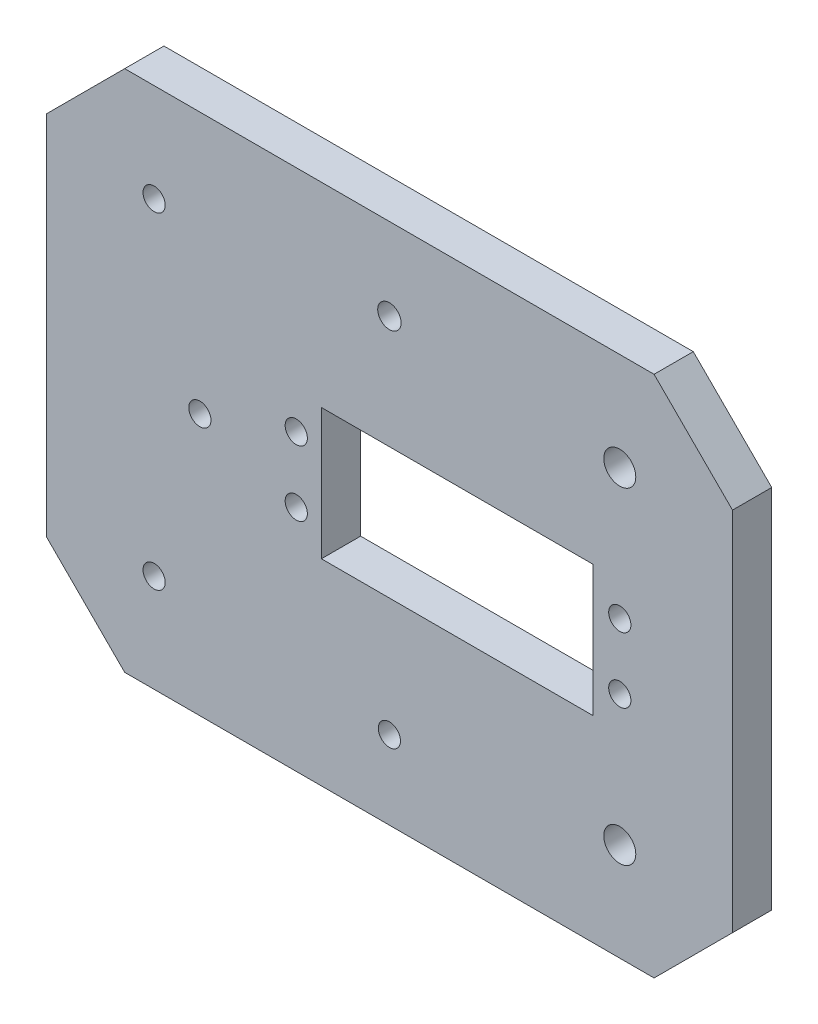
ISO-10303-21;
HEADER;
FILE_DESCRIPTION(('STEP AP214'),'2;1');
FILE_NAME('part.step','',(''),(''),'','','');
FILE_SCHEMA(('AUTOMOTIVE_DESIGN { 1 0 10303 214 1 1 1 1 }'));
ENDSEC;
DATA;
#1=APPLICATION_CONTEXT('core data for automotive mechanical design processes');
#2=APPLICATION_PROTOCOL_DEFINITION('international standard','automotive_design',2000,#1);
#3=PRODUCT_CONTEXT('',#1,'mechanical');
#4=PRODUCT('Part','Part','',(#3));
#5=PRODUCT_RELATED_PRODUCT_CATEGORY('part','',(#4));
#6=PRODUCT_DEFINITION_FORMATION('','',#4);
#7=PRODUCT_DEFINITION_CONTEXT('part definition',#1,'design');
#8=PRODUCT_DEFINITION('design','',#6,#7);
#9=PRODUCT_DEFINITION_SHAPE('','',#8);
#10=(LENGTH_UNIT() NAMED_UNIT(*) SI_UNIT(.MILLI.,.METRE.));
#11=(NAMED_UNIT(*) PLANE_ANGLE_UNIT() SI_UNIT($,.RADIAN.));
#12=(NAMED_UNIT(*) SI_UNIT($,.STERADIAN.) SOLID_ANGLE_UNIT());
#13=UNCERTAINTY_MEASURE_WITH_UNIT(LENGTH_MEASURE(1.E-05),#10,'distance_accuracy_value','');
#14=(GEOMETRIC_REPRESENTATION_CONTEXT(3) GLOBAL_UNCERTAINTY_ASSIGNED_CONTEXT((#13)) GLOBAL_UNIT_ASSIGNED_CONTEXT((#10,
#11,#12)) REPRESENTATION_CONTEXT('',''));
#15=CARTESIAN_POINT('',(0.,0.,0.));
#16=DIRECTION('',(0.,0.,1.));
#17=DIRECTION('',(1.,0.,0.));
#18=AXIS2_PLACEMENT_3D('',#15,#16,#17);
#19=CARTESIAN_POINT('',(0.,0.,6.));
#20=DIRECTION('',(0.,0.,1.));
#21=DIRECTION('',(1.,0.,0.));
#22=AXIS2_PLACEMENT_3D('',#19,#20,#21);
#23=PLANE('',#22);
#24=CARTESIAN_POINT('',(0.,-28.,6.));
#25=DIRECTION('',(0.,0.,1.));
#26=DIRECTION('',(1.,0.,0.));
#27=AXIS2_PLACEMENT_3D('',#24,#25,#26);
#28=CIRCLE('',#27,1.7);
#29=CARTESIAN_POINT('',(1.7,-28.,6.));
#30=VERTEX_POINT('',#29);
#31=EDGE_CURVE('E355',#30,#30,#28,.T.);
#32=ORIENTED_EDGE('',*,*,#31,.F.);
#33=EDGE_LOOP('',(#32));
#34=FACE_BOUND('',#33,.T.);
#35=CARTESIAN_POINT('',(35.25,25.,6.));
#36=DIRECTION('',(0.,0.,1.));
#37=DIRECTION('',(1.,0.,0.));
#38=AXIS2_PLACEMENT_3D('',#35,#36,#37);
#39=CIRCLE('',#38,2.45);
#40=CARTESIAN_POINT('',(37.7,25.,6.));
#41=VERTEX_POINT('',#40);
#42=EDGE_CURVE('E367',#41,#41,#39,.T.);
#43=ORIENTED_EDGE('',*,*,#42,.F.);
#44=EDGE_LOOP('',(#43));
#45=FACE_BOUND('',#44,.T.);
#46=CARTESIAN_POINT('',(-36.,25.,6.));
#47=DIRECTION('',(0.,0.,1.));
#48=DIRECTION('',(1.,0.,0.));
#49=AXIS2_PLACEMENT_3D('',#46,#47,#48);
#50=CIRCLE('',#49,1.7);
#51=CARTESIAN_POINT('',(-34.3,25.,6.));
#52=VERTEX_POINT('',#51);
#53=EDGE_CURVE('E379',#52,#52,#50,.T.);
#54=ORIENTED_EDGE('',*,*,#53,.F.);
#55=EDGE_LOOP('',(#54));
#56=FACE_BOUND('',#55,.T.);
#57=CARTESIAN_POINT('',(35.25,5.,6.));
#58=DIRECTION('',(0.,0.,1.));
#59=DIRECTION('',(1.,0.,0.));
#60=AXIS2_PLACEMENT_3D('',#57,#58,#59);
#61=CIRCLE('',#60,1.7);
#62=CARTESIAN_POINT('',(36.95,5.,6.));
#63=VERTEX_POINT('',#62);
#64=EDGE_CURVE('E391',#63,#63,#61,.T.);
#65=ORIENTED_EDGE('',*,*,#64,.F.);
#66=EDGE_LOOP('',(#65));
#67=FACE_BOUND('',#66,.T.);
#68=CARTESIAN_POINT('',(-14.25,5.,6.));
#69=DIRECTION('',(0.,0.,1.));
#70=DIRECTION('',(1.,0.,0.));
#71=AXIS2_PLACEMENT_3D('',#68,#69,#70);
#72=CIRCLE('',#71,1.7);
#73=CARTESIAN_POINT('',(-12.55,5.,6.));
#74=VERTEX_POINT('',#73);
#75=EDGE_CURVE('E403',#74,#74,#72,.T.);
#76=ORIENTED_EDGE('',*,*,#75,.F.);
#77=EDGE_LOOP('',(#76));
#78=FACE_BOUND('',#77,.T.);
#79=DIRECTION('',(1.,0.,0.));
#80=VECTOR('',#79,1.);
#81=CARTESIAN_POINT('',(-10.3999999999998,-9.90000000000016,6.));
#82=LINE('',#81,#80);
#83=CARTESIAN_POINT('',(-10.3999999999998,-9.90000000000016,6.));
#84=VERTEX_POINT('',#83);
#85=CARTESIAN_POINT('',(31.15,-9.90000000000016,6.));
#86=VERTEX_POINT('',#85);
#87=EDGE_CURVE('E138',#84,#86,#82,.T.);
#88=ORIENTED_EDGE('',*,*,#87,.F.);
#89=DIRECTION('',(0.,-1.,0.));
#90=VECTOR('',#89,1.);
#91=CARTESIAN_POINT('',(-10.3999999999998,-9.90000000000016,6.));
#92=LINE('',#91,#90);
#93=CARTESIAN_POINT('',(-10.3999999999998,10.15,6.));
#94=VERTEX_POINT('',#93);
#95=EDGE_CURVE('E130',#94,#84,#92,.T.);
#96=ORIENTED_EDGE('',*,*,#95,.F.);
#97=DIRECTION('',(-1.,0.,0.));
#98=VECTOR('',#97,1.);
#99=CARTESIAN_POINT('',(-10.3999999999998,10.15,6.));
#100=LINE('',#99,#98);
#101=CARTESIAN_POINT('',(31.15,10.15,6.));
#102=VERTEX_POINT('',#101);
#103=EDGE_CURVE('E153',#102,#94,#100,.T.);
#104=ORIENTED_EDGE('',*,*,#103,.F.);
#105=DIRECTION('',(0.,1.,0.));
#106=VECTOR('',#105,1.);
#107=CARTESIAN_POINT('',(31.15,-9.90000000000016,6.));
#108=LINE('',#107,#106);
#109=EDGE_CURVE('E151',#86,#102,#108,.T.);
#110=ORIENTED_EDGE('',*,*,#109,.F.);
#111=EDGE_LOOP('',(#88,#96,#104,#110));
#112=FACE_BOUND('',#111,.T.);
#113=DIRECTION('',(0.707106781186544,-0.707106781186551,0.));
#114=VECTOR('',#113,1.);
#115=CARTESIAN_POINT('',(-52.4999999999999,-28.,6.));
#116=LINE('',#115,#114);
#117=CARTESIAN_POINT('',(-52.4999999999999,-28.,6.));
#118=VERTEX_POINT('',#117);
#119=CARTESIAN_POINT('',(-40.5,-40.,6.));
#120=VERTEX_POINT('',#119);
#121=EDGE_CURVE('E169',#118,#120,#116,.T.);
#122=ORIENTED_EDGE('',*,*,#121,.T.);
#123=DIRECTION('',(1.,0.,0.));
#124=VECTOR('',#123,1.);
#125=CARTESIAN_POINT('',(-40.5,-40.,6.));
#126=LINE('',#125,#124);
#127=CARTESIAN_POINT('',(40.5,-40.,6.));
#128=VERTEX_POINT('',#127);
#129=EDGE_CURVE('E172',#120,#128,#126,.T.);
#130=ORIENTED_EDGE('',*,*,#129,.T.);
#131=DIRECTION('',(0.707106781186546,0.707106781186549,0.));
#132=VECTOR('',#131,1.);
#133=CARTESIAN_POINT('',(40.5,-40.,6.));
#134=LINE('',#133,#132);
#135=CARTESIAN_POINT('',(52.5,-28.,6.));
#136=VERTEX_POINT('',#135);
#137=EDGE_CURVE('E175',#128,#136,#134,.T.);
#138=ORIENTED_EDGE('',*,*,#137,.T.);
#139=DIRECTION('',(0.,1.,0.));
#140=VECTOR('',#139,1.);
#141=CARTESIAN_POINT('',(52.5,-28.,6.));
#142=LINE('',#141,#140);
#143=CARTESIAN_POINT('',(52.5,28.,6.));
#144=VERTEX_POINT('',#143);
#145=EDGE_CURVE('E177',#136,#144,#142,.T.);
#146=ORIENTED_EDGE('',*,*,#145,.T.);
#147=DIRECTION('',(-0.707106781186549,0.707106781186546,0.));
#148=VECTOR('',#147,1.);
#149=CARTESIAN_POINT('',(52.5,28.,6.));
#150=LINE('',#149,#148);
#151=CARTESIAN_POINT('',(40.5,39.9999999999999,6.));
#152=VERTEX_POINT('',#151);
#153=EDGE_CURVE('E179',#144,#152,#150,.T.);
#154=ORIENTED_EDGE('',*,*,#153,.T.);
#155=DIRECTION('',(-1.,0.,0.));
#156=VECTOR('',#155,1.);
#157=CARTESIAN_POINT('',(40.5,39.9999999999999,6.));
#158=LINE('',#157,#156);
#159=CARTESIAN_POINT('',(-40.5,39.9999999999999,6.));
#160=VERTEX_POINT('',#159);
#161=EDGE_CURVE('E181',#152,#160,#158,.T.);
#162=ORIENTED_EDGE('',*,*,#161,.T.);
#163=DIRECTION('',(-0.707106781186546,-0.707106781186549,0.));
#164=VECTOR('',#163,1.);
#165=CARTESIAN_POINT('',(-40.5,39.9999999999999,6.));
#166=LINE('',#165,#164);
#167=CARTESIAN_POINT('',(-52.4999999999999,28.,6.));
#168=VERTEX_POINT('',#167);
#169=EDGE_CURVE('E183',#160,#168,#166,.T.);
#170=ORIENTED_EDGE('',*,*,#169,.T.);
#171=DIRECTION('',(0.,-1.,0.));
#172=VECTOR('',#171,1.);
#173=CARTESIAN_POINT('',(-52.4999999999999,28.,6.));
#174=LINE('',#173,#172);
#175=EDGE_CURVE('E185',#168,#118,#174,.T.);
#176=ORIENTED_EDGE('',*,*,#175,.T.);
#177=EDGE_LOOP('',(#122,#130,#138,#146,#154,#162,#170,#176));
#178=FACE_BOUND('',#177,.T.);
#179=CARTESIAN_POINT('',(-14.25,-5.,6.));
#180=DIRECTION('',(0.,0.,1.));
#181=DIRECTION('',(1.,0.,0.));
#182=AXIS2_PLACEMENT_3D('',#179,#180,#181);
#183=CIRCLE('',#182,1.7);
#184=CARTESIAN_POINT('',(-12.55,-5.,6.));
#185=VERTEX_POINT('',#184);
#186=EDGE_CURVE('E159',#185,#185,#183,.T.);
#187=ORIENTED_EDGE('',*,*,#186,.F.);
#188=EDGE_LOOP('',(#187));
#189=FACE_BOUND('',#188,.T.);
#190=CARTESIAN_POINT('',(35.25,-5.,6.));
#191=DIRECTION('',(0.,0.,1.));
#192=DIRECTION('',(1.,0.,0.));
#193=AXIS2_PLACEMENT_3D('',#190,#191,#192);
#194=CIRCLE('',#193,1.7);
#195=CARTESIAN_POINT('',(36.95,-5.,6.));
#196=VERTEX_POINT('',#195);
#197=EDGE_CURVE('E397',#196,#196,#194,.T.);
#198=ORIENTED_EDGE('',*,*,#197,.F.);
#199=EDGE_LOOP('',(#198));
#200=FACE_BOUND('',#199,.T.);
#201=CARTESIAN_POINT('',(-36.,-25.,6.));
#202=DIRECTION('',(0.,0.,1.));
#203=DIRECTION('',(1.,0.,0.));
#204=AXIS2_PLACEMENT_3D('',#201,#202,#203);
#205=CIRCLE('',#204,1.7);
#206=CARTESIAN_POINT('',(-34.3,-25.,6.));
#207=VERTEX_POINT('',#206);
#208=EDGE_CURVE('E385',#207,#207,#205,.T.);
#209=ORIENTED_EDGE('',*,*,#208,.F.);
#210=EDGE_LOOP('',(#209));
#211=FACE_BOUND('',#210,.T.);
#212=CARTESIAN_POINT('',(35.25,-25.,6.));
#213=DIRECTION('',(0.,0.,1.));
#214=DIRECTION('',(1.,0.,0.));
#215=AXIS2_PLACEMENT_3D('',#212,#213,#214);
#216=CIRCLE('',#215,2.45);
#217=CARTESIAN_POINT('',(37.7,-25.,6.));
#218=VERTEX_POINT('',#217);
#219=EDGE_CURVE('E373',#218,#218,#216,.T.);
#220=ORIENTED_EDGE('',*,*,#219,.F.);
#221=EDGE_LOOP('',(#220));
#222=FACE_BOUND('',#221,.T.);
#223=CARTESIAN_POINT('',(0.,27.45,6.));
#224=DIRECTION('',(0.,0.,1.));
#225=DIRECTION('',(1.,0.,0.));
#226=AXIS2_PLACEMENT_3D('',#223,#224,#225);
#227=CIRCLE('',#226,1.78675683852056);
#228=CARTESIAN_POINT('',(1.78675683852056,27.45,6.));
#229=VERTEX_POINT('',#228);
#230=EDGE_CURVE('E361',#229,#229,#227,.T.);
#231=ORIENTED_EDGE('',*,*,#230,.F.);
#232=EDGE_LOOP('',(#231));
#233=FACE_BOUND('',#232,.T.);
#234=CARTESIAN_POINT('',(-29.,0.,6.));
#235=DIRECTION('',(0.,0.,1.));
#236=DIRECTION('',(1.,0.,0.));
#237=AXIS2_PLACEMENT_3D('',#234,#235,#236);
#238=CIRCLE('',#237,1.7);
#239=CARTESIAN_POINT('',(-27.3,0.,6.));
#240=VERTEX_POINT('',#239);
#241=EDGE_CURVE('E346',#240,#240,#238,.T.);
#242=ORIENTED_EDGE('',*,*,#241,.F.);
#243=EDGE_LOOP('',(#242));
#244=FACE_BOUND('',#243,.T.);
#245=ADVANCED_FACE('F41',(#34,#45,#56,#67,#78,#112,#178,#189,#200,#211,#222,#233,#244),#23,.T.);
#246=CARTESIAN_POINT('',(0.,0.,0.));
#247=DIRECTION('',(0.,0.,1.));
#248=DIRECTION('',(1.,0.,0.));
#249=AXIS2_PLACEMENT_3D('',#246,#247,#248);
#250=PLANE('',#249);
#251=DIRECTION('',(0.707106781186544,-0.707106781186551,0.));
#252=VECTOR('',#251,1.);
#253=CARTESIAN_POINT('',(-52.4999999999999,-28.,0.));
#254=LINE('',#253,#252);
#255=CARTESIAN_POINT('',(-52.4999999999999,-28.,0.));
#256=VERTEX_POINT('',#255);
#257=CARTESIAN_POINT('',(-40.5,-40.,0.));
#258=VERTEX_POINT('',#257);
#259=EDGE_CURVE('E146',#256,#258,#254,.T.);
#260=ORIENTED_EDGE('',*,*,#259,.F.);
#261=DIRECTION('',(0.,-1.,0.));
#262=VECTOR('',#261,1.);
#263=CARTESIAN_POINT('',(-52.4999999999999,28.,0.));
#264=LINE('',#263,#262);
#265=CARTESIAN_POINT('',(-52.4999999999999,28.,0.));
#266=VERTEX_POINT('',#265);
#267=EDGE_CURVE('E173',#266,#256,#264,.T.);
#268=ORIENTED_EDGE('',*,*,#267,.F.);
#269=DIRECTION('',(-0.707106781186546,-0.707106781186549,0.));
#270=VECTOR('',#269,1.);
#271=CARTESIAN_POINT('',(-40.5,39.9999999999999,0.));
#272=LINE('',#271,#270);
#273=CARTESIAN_POINT('',(-40.5,39.9999999999999,0.));
#274=VERTEX_POINT('',#273);
#275=EDGE_CURVE('E200',#274,#266,#272,.T.);
#276=ORIENTED_EDGE('',*,*,#275,.F.);
#277=DIRECTION('',(-1.,0.,0.));
#278=VECTOR('',#277,1.);
#279=CARTESIAN_POINT('',(40.5,39.9999999999999,0.));
#280=LINE('',#279,#278);
#281=CARTESIAN_POINT('',(40.5,39.9999999999999,0.));
#282=VERTEX_POINT('',#281);
#283=EDGE_CURVE('E198',#282,#274,#280,.T.);
#284=ORIENTED_EDGE('',*,*,#283,.F.);
#285=DIRECTION('',(-0.707106781186549,0.707106781186546,0.));
#286=VECTOR('',#285,1.);
#287=CARTESIAN_POINT('',(52.5,28.,0.));
#288=LINE('',#287,#286);
#289=CARTESIAN_POINT('',(52.5,28.,0.));
#290=VERTEX_POINT('',#289);
#291=EDGE_CURVE('E196',#290,#282,#288,.T.);
#292=ORIENTED_EDGE('',*,*,#291,.F.);
#293=DIRECTION('',(0.,1.,0.));
#294=VECTOR('',#293,1.);
#295=CARTESIAN_POINT('',(52.5,-28.,0.));
#296=LINE('',#295,#294);
#297=CARTESIAN_POINT('',(52.5,-28.,0.));
#298=VERTEX_POINT('',#297);
#299=EDGE_CURVE('E194',#298,#290,#296,.T.);
#300=ORIENTED_EDGE('',*,*,#299,.F.);
#301=DIRECTION('',(0.707106781186546,0.707106781186549,0.));
#302=VECTOR('',#301,1.);
#303=CARTESIAN_POINT('',(40.5,-40.,0.));
#304=LINE('',#303,#302);
#305=CARTESIAN_POINT('',(40.5,-40.,0.));
#306=VERTEX_POINT('',#305);
#307=EDGE_CURVE('E192',#306,#298,#304,.T.);
#308=ORIENTED_EDGE('',*,*,#307,.F.);
#309=DIRECTION('',(1.,0.,0.));
#310=VECTOR('',#309,1.);
#311=CARTESIAN_POINT('',(-40.5,-40.,0.));
#312=LINE('',#311,#310);
#313=EDGE_CURVE('E190',#258,#306,#312,.T.);
#314=ORIENTED_EDGE('',*,*,#313,.F.);
#315=EDGE_LOOP('',(#260,#268,#276,#284,#292,#300,#308,#314));
#316=FACE_BOUND('',#315,.T.);
#317=DIRECTION('',(0.,-1.,0.));
#318=VECTOR('',#317,1.);
#319=CARTESIAN_POINT('',(-10.3999999999998,-9.90000000000016,0.));
#320=LINE('',#319,#318);
#321=CARTESIAN_POINT('',(-10.3999999999998,10.15,0.));
#322=VERTEX_POINT('',#321);
#323=CARTESIAN_POINT('',(-10.3999999999998,-9.90000000000016,0.));
#324=VERTEX_POINT('',#323);
#325=EDGE_CURVE('E64',#322,#324,#320,.T.);
#326=ORIENTED_EDGE('',*,*,#325,.T.);
#327=DIRECTION('',(1.,0.,0.));
#328=VECTOR('',#327,1.);
#329=CARTESIAN_POINT('',(-10.3999999999998,-9.90000000000016,0.));
#330=LINE('',#329,#328);
#331=CARTESIAN_POINT('',(31.15,-9.90000000000016,0.));
#332=VERTEX_POINT('',#331);
#333=EDGE_CURVE('E145',#324,#332,#330,.T.);
#334=ORIENTED_EDGE('',*,*,#333,.T.);
#335=DIRECTION('',(0.,1.,0.));
#336=VECTOR('',#335,1.);
#337=CARTESIAN_POINT('',(31.15,-9.90000000000016,0.));
#338=LINE('',#337,#336);
#339=CARTESIAN_POINT('',(31.15,10.15,0.));
#340=VERTEX_POINT('',#339);
#341=EDGE_CURVE('E161',#332,#340,#338,.T.);
#342=ORIENTED_EDGE('',*,*,#341,.T.);
#343=DIRECTION('',(-1.,0.,0.));
#344=VECTOR('',#343,1.);
#345=CARTESIAN_POINT('',(-10.3999999999998,10.15,0.));
#346=LINE('',#345,#344);
#347=EDGE_CURVE('E139',#340,#322,#346,.T.);
#348=ORIENTED_EDGE('',*,*,#347,.T.);
#349=EDGE_LOOP('',(#326,#334,#342,#348));
#350=FACE_BOUND('',#349,.T.);
#351=CARTESIAN_POINT('',(-14.25,-5.,0.));
#352=DIRECTION('',(0.,0.,1.));
#353=DIRECTION('',(1.,0.,0.));
#354=AXIS2_PLACEMENT_3D('',#351,#352,#353);
#355=CIRCLE('',#354,1.7);
#356=CARTESIAN_POINT('',(-12.55,-5.,0.));
#357=VERTEX_POINT('',#356);
#358=EDGE_CURVE('E406',#357,#357,#355,.T.);
#359=ORIENTED_EDGE('',*,*,#358,.T.);
#360=EDGE_LOOP('',(#359));
#361=FACE_BOUND('',#360,.T.);
#362=CARTESIAN_POINT('',(-14.25,5.,0.));
#363=DIRECTION('',(0.,0.,1.));
#364=DIRECTION('',(1.,0.,0.));
#365=AXIS2_PLACEMENT_3D('',#362,#363,#364);
#366=CIRCLE('',#365,1.7);
#367=CARTESIAN_POINT('',(-12.55,5.,0.));
#368=VERTEX_POINT('',#367);
#369=EDGE_CURVE('E400',#368,#368,#366,.T.);
#370=ORIENTED_EDGE('',*,*,#369,.T.);
#371=EDGE_LOOP('',(#370));
#372=FACE_BOUND('',#371,.T.);
#373=CARTESIAN_POINT('',(35.25,-5.,0.));
#374=DIRECTION('',(0.,0.,1.));
#375=DIRECTION('',(1.,0.,0.));
#376=AXIS2_PLACEMENT_3D('',#373,#374,#375);
#377=CIRCLE('',#376,1.7);
#378=CARTESIAN_POINT('',(36.95,-5.,0.));
#379=VERTEX_POINT('',#378);
#380=EDGE_CURVE('E394',#379,#379,#377,.T.);
#381=ORIENTED_EDGE('',*,*,#380,.T.);
#382=EDGE_LOOP('',(#381));
#383=FACE_BOUND('',#382,.T.);
#384=CARTESIAN_POINT('',(35.25,5.,0.));
#385=DIRECTION('',(0.,0.,1.));
#386=DIRECTION('',(1.,0.,0.));
#387=AXIS2_PLACEMENT_3D('',#384,#385,#386);
#388=CIRCLE('',#387,1.7);
#389=CARTESIAN_POINT('',(36.95,5.,0.));
#390=VERTEX_POINT('',#389);
#391=EDGE_CURVE('E388',#390,#390,#388,.T.);
#392=ORIENTED_EDGE('',*,*,#391,.T.);
#393=EDGE_LOOP('',(#392));
#394=FACE_BOUND('',#393,.T.);
#395=CARTESIAN_POINT('',(-36.,-25.,0.));
#396=DIRECTION('',(0.,0.,1.));
#397=DIRECTION('',(1.,0.,0.));
#398=AXIS2_PLACEMENT_3D('',#395,#396,#397);
#399=CIRCLE('',#398,1.7);
#400=CARTESIAN_POINT('',(-34.3,-25.,0.));
#401=VERTEX_POINT('',#400);
#402=EDGE_CURVE('E382',#401,#401,#399,.T.);
#403=ORIENTED_EDGE('',*,*,#402,.T.);
#404=EDGE_LOOP('',(#403));
#405=FACE_BOUND('',#404,.T.);
#406=CARTESIAN_POINT('',(-36.,25.,0.));
#407=DIRECTION('',(0.,0.,1.));
#408=DIRECTION('',(1.,0.,0.));
#409=AXIS2_PLACEMENT_3D('',#406,#407,#408);
#410=CIRCLE('',#409,1.7);
#411=CARTESIAN_POINT('',(-34.3,25.,0.));
#412=VERTEX_POINT('',#411);
#413=EDGE_CURVE('E376',#412,#412,#410,.T.);
#414=ORIENTED_EDGE('',*,*,#413,.T.);
#415=EDGE_LOOP('',(#414));
#416=FACE_BOUND('',#415,.T.);
#417=CARTESIAN_POINT('',(35.25,-25.,0.));
#418=DIRECTION('',(0.,0.,1.));
#419=DIRECTION('',(1.,0.,0.));
#420=AXIS2_PLACEMENT_3D('',#417,#418,#419);
#421=CIRCLE('',#420,2.45);
#422=CARTESIAN_POINT('',(37.7,-25.,0.));
#423=VERTEX_POINT('',#422);
#424=EDGE_CURVE('E370',#423,#423,#421,.T.);
#425=ORIENTED_EDGE('',*,*,#424,.T.);
#426=EDGE_LOOP('',(#425));
#427=FACE_BOUND('',#426,.T.);
#428=CARTESIAN_POINT('',(35.25,25.,0.));
#429=DIRECTION('',(0.,0.,1.));
#430=DIRECTION('',(1.,0.,0.));
#431=AXIS2_PLACEMENT_3D('',#428,#429,#430);
#432=CIRCLE('',#431,2.45);
#433=CARTESIAN_POINT('',(37.7,25.,0.));
#434=VERTEX_POINT('',#433);
#435=EDGE_CURVE('E364',#434,#434,#432,.T.);
#436=ORIENTED_EDGE('',*,*,#435,.T.);
#437=EDGE_LOOP('',(#436));
#438=FACE_BOUND('',#437,.T.);
#439=CARTESIAN_POINT('',(0.,27.45,0.));
#440=DIRECTION('',(0.,0.,1.));
#441=DIRECTION('',(1.,0.,0.));
#442=AXIS2_PLACEMENT_3D('',#439,#440,#441);
#443=CIRCLE('',#442,1.78675683852056);
#444=CARTESIAN_POINT('',(1.78675683852056,27.45,0.));
#445=VERTEX_POINT('',#444);
#446=EDGE_CURVE('E358',#445,#445,#443,.T.);
#447=ORIENTED_EDGE('',*,*,#446,.T.);
#448=EDGE_LOOP('',(#447));
#449=FACE_BOUND('',#448,.T.);
#450=CARTESIAN_POINT('',(0.,-28.,0.));
#451=DIRECTION('',(0.,0.,1.));
#452=DIRECTION('',(1.,0.,0.));
#453=AXIS2_PLACEMENT_3D('',#450,#451,#452);
#454=CIRCLE('',#453,1.7);
#455=CARTESIAN_POINT('',(1.7,-28.,0.));
#456=VERTEX_POINT('',#455);
#457=EDGE_CURVE('E352',#456,#456,#454,.T.);
#458=ORIENTED_EDGE('',*,*,#457,.T.);
#459=EDGE_LOOP('',(#458));
#460=FACE_BOUND('',#459,.T.);
#461=CARTESIAN_POINT('',(-29.,0.,0.));
#462=DIRECTION('',(0.,0.,1.));
#463=DIRECTION('',(1.,0.,0.));
#464=AXIS2_PLACEMENT_3D('',#461,#462,#463);
#465=CIRCLE('',#464,1.7);
#466=CARTESIAN_POINT('',(-27.3,0.,0.));
#467=VERTEX_POINT('',#466);
#468=EDGE_CURVE('E349',#467,#467,#465,.T.);
#469=ORIENTED_EDGE('',*,*,#468,.T.);
#470=EDGE_LOOP('',(#469));
#471=FACE_BOUND('',#470,.T.);
#472=ADVANCED_FACE('F230',(#316,#350,#361,#372,#383,#394,#405,#416,#427,#438,#449,#460,#471),
#250,.F.);
#473=CARTESIAN_POINT('',(-52.4999999999999,-28.,6.));
#474=DIRECTION('',(0.707106781186551,0.707106781186544,0.));
#475=DIRECTION('',(-0.707106781186544,0.707106781186551,0.));
#476=AXIS2_PLACEMENT_3D('',#473,#474,#475);
#477=PLANE('',#476);
#478=ORIENTED_EDGE('',*,*,#259,.T.);
#479=DIRECTION('',(0.,0.,-1.));
#480=VECTOR('',#479,1.);
#481=CARTESIAN_POINT('',(-40.5,-40.,6.));
#482=LINE('',#481,#480);
#483=EDGE_CURVE('E11',#120,#258,#482,.T.);
#484=ORIENTED_EDGE('',*,*,#483,.F.);
#485=ORIENTED_EDGE('',*,*,#121,.F.);
#486=DIRECTION('',(0.,0.,-1.));
#487=VECTOR('',#486,1.);
#488=CARTESIAN_POINT('',(-52.4999999999999,-28.,6.));
#489=LINE('',#488,#487);
#490=EDGE_CURVE('E187',#118,#256,#489,.T.);
#491=ORIENTED_EDGE('',*,*,#490,.T.);
#492=EDGE_LOOP('',(#478,#484,#485,#491));
#493=FACE_BOUND('',#492,.T.);
#494=ADVANCED_FACE('F43',(#493),#477,.F.);
#495=CARTESIAN_POINT('',(-40.5,-40.,6.));
#496=DIRECTION('',(0.,1.,0.));
#497=DIRECTION('',(0.,0.,1.));
#498=AXIS2_PLACEMENT_3D('',#495,#496,#497);
#499=PLANE('',#498);
#500=ORIENTED_EDGE('',*,*,#313,.T.);
#501=DIRECTION('',(0.,0.,-1.));
#502=VECTOR('',#501,1.);
#503=CARTESIAN_POINT('',(40.5,-40.,6.));
#504=LINE('',#503,#502);
#505=EDGE_CURVE('E49',#128,#306,#504,.T.);
#506=ORIENTED_EDGE('',*,*,#505,.F.);
#507=ORIENTED_EDGE('',*,*,#129,.F.);
#508=ORIENTED_EDGE('',*,*,#483,.T.);
#509=EDGE_LOOP('',(#500,#506,#507,#508));
#510=FACE_BOUND('',#509,.T.);
#511=ADVANCED_FACE('F247',(#510),#499,.F.);
#512=CARTESIAN_POINT('',(40.5,-40.,6.));
#513=DIRECTION('',(-0.707106781186549,0.707106781186546,0.));
#514=DIRECTION('',(-0.707106781186546,-0.707106781186549,0.));
#515=AXIS2_PLACEMENT_3D('',#512,#513,#514);
#516=PLANE('',#515);
#517=ORIENTED_EDGE('',*,*,#307,.T.);
#518=DIRECTION('',(0.,0.,-1.));
#519=VECTOR('',#518,1.);
#520=CARTESIAN_POINT('',(52.5,-28.,6.));
#521=LINE('',#520,#519);
#522=EDGE_CURVE('E217',#136,#298,#521,.T.);
#523=ORIENTED_EDGE('',*,*,#522,.F.);
#524=ORIENTED_EDGE('',*,*,#137,.F.);
#525=ORIENTED_EDGE('',*,*,#505,.T.);
#526=EDGE_LOOP('',(#517,#523,#524,#525));
#527=FACE_BOUND('',#526,.T.);
#528=ADVANCED_FACE('F224',(#527),#516,.F.);
#529=CARTESIAN_POINT('',(52.5,-28.,6.));
#530=DIRECTION('',(-1.,0.,0.));
#531=DIRECTION('',(0.,0.,1.));
#532=AXIS2_PLACEMENT_3D('',#529,#530,#531);
#533=PLANE('',#532);
#534=ORIENTED_EDGE('',*,*,#299,.T.);
#535=DIRECTION('',(0.,0.,-1.));
#536=VECTOR('',#535,1.);
#537=CARTESIAN_POINT('',(52.5,28.,6.));
#538=LINE('',#537,#536);
#539=EDGE_CURVE('E214',#144,#290,#538,.T.);
#540=ORIENTED_EDGE('',*,*,#539,.F.);
#541=ORIENTED_EDGE('',*,*,#145,.F.);
#542=ORIENTED_EDGE('',*,*,#522,.T.);
#543=EDGE_LOOP('',(#534,#540,#541,#542));
#544=FACE_BOUND('',#543,.T.);
#545=ADVANCED_FACE('F236',(#544),#533,.F.);
#546=CARTESIAN_POINT('',(52.5,28.,6.));
#547=DIRECTION('',(-0.707106781186546,-0.707106781186549,0.));
#548=DIRECTION('',(0.707106781186549,-0.707106781186546,0.));
#549=AXIS2_PLACEMENT_3D('',#546,#547,#548);
#550=PLANE('',#549);
#551=ORIENTED_EDGE('',*,*,#291,.T.);
#552=DIRECTION('',(0.,0.,-1.));
#553=VECTOR('',#552,1.);
#554=CARTESIAN_POINT('',(40.5,39.9999999999999,6.));
#555=LINE('',#554,#553);
#556=EDGE_CURVE('E211',#152,#282,#555,.T.);
#557=ORIENTED_EDGE('',*,*,#556,.F.);
#558=ORIENTED_EDGE('',*,*,#153,.F.);
#559=ORIENTED_EDGE('',*,*,#539,.T.);
#560=EDGE_LOOP('',(#551,#557,#558,#559));
#561=FACE_BOUND('',#560,.T.);
#562=ADVANCED_FACE('F240',(#561),#550,.F.);
#563=CARTESIAN_POINT('',(40.5,39.9999999999999,6.));
#564=DIRECTION('',(0.,-1.,0.));
#565=DIRECTION('',(0.,0.,-1.));
#566=AXIS2_PLACEMENT_3D('',#563,#564,#565);
#567=PLANE('',#566);
#568=ORIENTED_EDGE('',*,*,#283,.T.);
#569=DIRECTION('',(0.,0.,-1.));
#570=VECTOR('',#569,1.);
#571=CARTESIAN_POINT('',(-40.5,39.9999999999999,6.));
#572=LINE('',#571,#570);
#573=EDGE_CURVE('E208',#160,#274,#572,.T.);
#574=ORIENTED_EDGE('',*,*,#573,.F.);
#575=ORIENTED_EDGE('',*,*,#161,.F.);
#576=ORIENTED_EDGE('',*,*,#556,.T.);
#577=EDGE_LOOP('',(#568,#574,#575,#576));
#578=FACE_BOUND('',#577,.T.);
#579=ADVANCED_FACE('F260',(#578),#567,.F.);
#580=CARTESIAN_POINT('',(-40.5,39.9999999999999,6.));
#581=DIRECTION('',(0.707106781186548,-0.707106781186546,0.));
#582=DIRECTION('',(0.707106781186546,0.707106781186549,0.));
#583=AXIS2_PLACEMENT_3D('',#580,#581,#582);
#584=PLANE('',#583);
#585=ORIENTED_EDGE('',*,*,#275,.T.);
#586=DIRECTION('',(0.,0.,-1.));
#587=VECTOR('',#586,1.);
#588=CARTESIAN_POINT('',(-52.4999999999999,28.,6.));
#589=LINE('',#588,#587);
#590=EDGE_CURVE('E205',#168,#266,#589,.T.);
#591=ORIENTED_EDGE('',*,*,#590,.F.);
#592=ORIENTED_EDGE('',*,*,#169,.F.);
#593=ORIENTED_EDGE('',*,*,#573,.T.);
#594=EDGE_LOOP('',(#585,#591,#592,#593));
#595=FACE_BOUND('',#594,.T.);
#596=ADVANCED_FACE('F258',(#595),#584,.F.);
#597=CARTESIAN_POINT('',(-52.4999999999999,28.,6.));
#598=DIRECTION('',(1.,0.,0.));
#599=DIRECTION('',(0.,0.,-1.));
#600=AXIS2_PLACEMENT_3D('',#597,#598,#599);
#601=PLANE('',#600);
#602=ORIENTED_EDGE('',*,*,#267,.T.);
#603=ORIENTED_EDGE('',*,*,#490,.F.);
#604=ORIENTED_EDGE('',*,*,#175,.F.);
#605=ORIENTED_EDGE('',*,*,#590,.T.);
#606=EDGE_LOOP('',(#602,#603,#604,#605));
#607=FACE_BOUND('',#606,.T.);
#608=ADVANCED_FACE('F253',(#607),#601,.F.);
#609=CARTESIAN_POINT('',(-10.3999999999998,-9.90000000000016,6.));
#610=DIRECTION('',(1.,0.,0.));
#611=DIRECTION('',(0.,0.,-1.));
#612=AXIS2_PLACEMENT_3D('',#609,#610,#611);
#613=PLANE('',#612);
#614=ORIENTED_EDGE('',*,*,#325,.F.);
#615=DIRECTION('',(0.,0.,-1.));
#616=VECTOR('',#615,1.);
#617=CARTESIAN_POINT('',(-10.3999999999998,10.15,6.));
#618=LINE('',#617,#616);
#619=EDGE_CURVE('E134',#94,#322,#618,.T.);
#620=ORIENTED_EDGE('',*,*,#619,.F.);
#621=ORIENTED_EDGE('',*,*,#95,.T.);
#622=DIRECTION('',(0.,0.,-1.));
#623=VECTOR('',#622,1.);
#624=CARTESIAN_POINT('',(-10.3999999999998,-9.90000000000016,6.));
#625=LINE('',#624,#623);
#626=EDGE_CURVE('E133',#84,#324,#625,.T.);
#627=ORIENTED_EDGE('',*,*,#626,.T.);
#628=EDGE_LOOP('',(#614,#620,#621,#627));
#629=FACE_BOUND('',#628,.T.);
#630=ADVANCED_FACE('F132',(#629),#613,.T.);
#631=CARTESIAN_POINT('',(-10.3999999999998,-9.90000000000016,6.));
#632=DIRECTION('',(0.,1.,0.));
#633=DIRECTION('',(0.,0.,1.));
#634=AXIS2_PLACEMENT_3D('',#631,#632,#633);
#635=PLANE('',#634);
#636=ORIENTED_EDGE('',*,*,#333,.F.);
#637=ORIENTED_EDGE('',*,*,#626,.F.);
#638=ORIENTED_EDGE('',*,*,#87,.T.);
#639=DIRECTION('',(0.,0.,-1.));
#640=VECTOR('',#639,1.);
#641=CARTESIAN_POINT('',(31.15,-9.90000000000016,6.));
#642=LINE('',#641,#640);
#643=EDGE_CURVE('E147',#86,#332,#642,.T.);
#644=ORIENTED_EDGE('',*,*,#643,.T.);
#645=EDGE_LOOP('',(#636,#637,#638,#644));
#646=FACE_BOUND('',#645,.T.);
#647=ADVANCED_FACE('F142',(#646),#635,.T.);
#648=CARTESIAN_POINT('',(31.15,-9.90000000000016,6.));
#649=DIRECTION('',(-1.,0.,0.));
#650=DIRECTION('',(0.,0.,1.));
#651=AXIS2_PLACEMENT_3D('',#648,#649,#650);
#652=PLANE('',#651);
#653=ORIENTED_EDGE('',*,*,#341,.F.);
#654=ORIENTED_EDGE('',*,*,#643,.F.);
#655=ORIENTED_EDGE('',*,*,#109,.T.);
#656=DIRECTION('',(0.,0.,-1.));
#657=VECTOR('',#656,1.);
#658=CARTESIAN_POINT('',(31.15,10.15,6.));
#659=LINE('',#658,#657);
#660=EDGE_CURVE('E56',#102,#340,#659,.T.);
#661=ORIENTED_EDGE('',*,*,#660,.T.);
#662=EDGE_LOOP('',(#653,#654,#655,#661));
#663=FACE_BOUND('',#662,.T.);
#664=ADVANCED_FACE('F288',(#663),#652,.T.);
#665=CARTESIAN_POINT('',(-10.3999999999998,10.15,6.));
#666=DIRECTION('',(0.,-1.,0.));
#667=DIRECTION('',(0.,0.,-1.));
#668=AXIS2_PLACEMENT_3D('',#665,#666,#667);
#669=PLANE('',#668);
#670=ORIENTED_EDGE('',*,*,#347,.F.);
#671=ORIENTED_EDGE('',*,*,#660,.F.);
#672=ORIENTED_EDGE('',*,*,#103,.T.);
#673=ORIENTED_EDGE('',*,*,#619,.T.);
#674=EDGE_LOOP('',(#670,#671,#672,#673));
#675=FACE_BOUND('',#674,.T.);
#676=ADVANCED_FACE('F292',(#675),#669,.T.);
#677=CARTESIAN_POINT('',(-14.25,-5.,6.));
#678=DIRECTION('',(0.,0.,-1.));
#679=DIRECTION('',(-1.,0.,0.));
#680=AXIS2_PLACEMENT_3D('',#677,#678,#679);
#681=CYLINDRICAL_SURFACE('',#680,1.7);
#682=ORIENTED_EDGE('',*,*,#186,.T.);
#683=EDGE_LOOP('',(#682));
#684=FACE_BOUND('',#683,.T.);
#685=ORIENTED_EDGE('',*,*,#358,.F.);
#686=EDGE_LOOP('',(#685));
#687=FACE_BOUND('',#686,.T.);
#688=ADVANCED_FACE('F298',(#684,#687),#681,.F.);
#689=CARTESIAN_POINT('',(-14.25,5.,6.));
#690=DIRECTION('',(0.,0.,-1.));
#691=DIRECTION('',(-1.,0.,0.));
#692=AXIS2_PLACEMENT_3D('',#689,#690,#691);
#693=CYLINDRICAL_SURFACE('',#692,1.7);
#694=ORIENTED_EDGE('',*,*,#75,.T.);
#695=EDGE_LOOP('',(#694));
#696=FACE_BOUND('',#695,.T.);
#697=ORIENTED_EDGE('',*,*,#369,.F.);
#698=EDGE_LOOP('',(#697));
#699=FACE_BOUND('',#698,.T.);
#700=ADVANCED_FACE('F301',(#696,#699),#693,.F.);
#701=CARTESIAN_POINT('',(35.25,-5.,6.));
#702=DIRECTION('',(0.,0.,-1.));
#703=DIRECTION('',(-1.,0.,0.));
#704=AXIS2_PLACEMENT_3D('',#701,#702,#703);
#705=CYLINDRICAL_SURFACE('',#704,1.7);
#706=ORIENTED_EDGE('',*,*,#197,.T.);
#707=EDGE_LOOP('',(#706));
#708=FACE_BOUND('',#707,.T.);
#709=ORIENTED_EDGE('',*,*,#380,.F.);
#710=EDGE_LOOP('',(#709));
#711=FACE_BOUND('',#710,.T.);
#712=ADVANCED_FACE('F305',(#708,#711),#705,.F.);
#713=CARTESIAN_POINT('',(35.25,5.,6.));
#714=DIRECTION('',(0.,0.,-1.));
#715=DIRECTION('',(-1.,0.,0.));
#716=AXIS2_PLACEMENT_3D('',#713,#714,#715);
#717=CYLINDRICAL_SURFACE('',#716,1.7);
#718=ORIENTED_EDGE('',*,*,#64,.T.);
#719=EDGE_LOOP('',(#718));
#720=FACE_BOUND('',#719,.T.);
#721=ORIENTED_EDGE('',*,*,#391,.F.);
#722=EDGE_LOOP('',(#721));
#723=FACE_BOUND('',#722,.T.);
#724=ADVANCED_FACE('F309',(#720,#723),#717,.F.);
#725=CARTESIAN_POINT('',(-36.,-25.,6.));
#726=DIRECTION('',(0.,0.,-1.));
#727=DIRECTION('',(-1.,0.,0.));
#728=AXIS2_PLACEMENT_3D('',#725,#726,#727);
#729=CYLINDRICAL_SURFACE('',#728,1.7);
#730=ORIENTED_EDGE('',*,*,#208,.T.);
#731=EDGE_LOOP('',(#730));
#732=FACE_BOUND('',#731,.T.);
#733=ORIENTED_EDGE('',*,*,#402,.F.);
#734=EDGE_LOOP('',(#733));
#735=FACE_BOUND('',#734,.T.);
#736=ADVANCED_FACE('F313',(#732,#735),#729,.F.);
#737=CARTESIAN_POINT('',(-36.,25.,6.));
#738=DIRECTION('',(0.,0.,-1.));
#739=DIRECTION('',(-1.,0.,0.));
#740=AXIS2_PLACEMENT_3D('',#737,#738,#739);
#741=CYLINDRICAL_SURFACE('',#740,1.7);
#742=ORIENTED_EDGE('',*,*,#53,.T.);
#743=EDGE_LOOP('',(#742));
#744=FACE_BOUND('',#743,.T.);
#745=ORIENTED_EDGE('',*,*,#413,.F.);
#746=EDGE_LOOP('',(#745));
#747=FACE_BOUND('',#746,.T.);
#748=ADVANCED_FACE('F317',(#744,#747),#741,.F.);
#749=CARTESIAN_POINT('',(35.25,-25.,6.));
#750=DIRECTION('',(0.,0.,-1.));
#751=DIRECTION('',(-1.,0.,0.));
#752=AXIS2_PLACEMENT_3D('',#749,#750,#751);
#753=CYLINDRICAL_SURFACE('',#752,2.45);
#754=ORIENTED_EDGE('',*,*,#219,.T.);
#755=EDGE_LOOP('',(#754));
#756=FACE_BOUND('',#755,.T.);
#757=ORIENTED_EDGE('',*,*,#424,.F.);
#758=EDGE_LOOP('',(#757));
#759=FACE_BOUND('',#758,.T.);
#760=ADVANCED_FACE('F321',(#756,#759),#753,.F.);
#761=CARTESIAN_POINT('',(35.25,25.,6.));
#762=DIRECTION('',(0.,0.,-1.));
#763=DIRECTION('',(-1.,0.,0.));
#764=AXIS2_PLACEMENT_3D('',#761,#762,#763);
#765=CYLINDRICAL_SURFACE('',#764,2.45);
#766=ORIENTED_EDGE('',*,*,#42,.T.);
#767=EDGE_LOOP('',(#766));
#768=FACE_BOUND('',#767,.T.);
#769=ORIENTED_EDGE('',*,*,#435,.F.);
#770=EDGE_LOOP('',(#769));
#771=FACE_BOUND('',#770,.T.);
#772=ADVANCED_FACE('F325',(#768,#771),#765,.F.);
#773=CARTESIAN_POINT('',(0.,27.45,6.));
#774=DIRECTION('',(0.,0.,-1.));
#775=DIRECTION('',(-1.,0.,0.));
#776=AXIS2_PLACEMENT_3D('',#773,#774,#775);
#777=CYLINDRICAL_SURFACE('',#776,1.78675683852056);
#778=ORIENTED_EDGE('',*,*,#230,.T.);
#779=EDGE_LOOP('',(#778));
#780=FACE_BOUND('',#779,.T.);
#781=ORIENTED_EDGE('',*,*,#446,.F.);
#782=EDGE_LOOP('',(#781));
#783=FACE_BOUND('',#782,.T.);
#784=ADVANCED_FACE('F329',(#780,#783),#777,.F.);
#785=CARTESIAN_POINT('',(0.,-28.,6.));
#786=DIRECTION('',(0.,0.,-1.));
#787=DIRECTION('',(-1.,0.,0.));
#788=AXIS2_PLACEMENT_3D('',#785,#786,#787);
#789=CYLINDRICAL_SURFACE('',#788,1.7);
#790=ORIENTED_EDGE('',*,*,#31,.T.);
#791=EDGE_LOOP('',(#790));
#792=FACE_BOUND('',#791,.T.);
#793=ORIENTED_EDGE('',*,*,#457,.F.);
#794=EDGE_LOOP('',(#793));
#795=FACE_BOUND('',#794,.T.);
#796=ADVANCED_FACE('F333',(#792,#795),#789,.F.);
#797=CARTESIAN_POINT('',(-29.,0.,6.));
#798=DIRECTION('',(0.,0.,-1.));
#799=DIRECTION('',(-1.,0.,0.));
#800=AXIS2_PLACEMENT_3D('',#797,#798,#799);
#801=CYLINDRICAL_SURFACE('',#800,1.7);
#802=ORIENTED_EDGE('',*,*,#241,.T.);
#803=EDGE_LOOP('',(#802));
#804=FACE_BOUND('',#803,.T.);
#805=ORIENTED_EDGE('',*,*,#468,.F.);
#806=EDGE_LOOP('',(#805));
#807=FACE_BOUND('',#806,.T.);
#808=ADVANCED_FACE('F337',(#804,#807),#801,.F.);
#809=CLOSED_SHELL('',(#245,#472,#494,#511,#528,#545,#562,#579,#596,#608,#630,#647,#664,#676,
#688,#700,#712,#724,#736,#748,#760,#772,#784,#796,#808));
#810=MANIFOLD_SOLID_BREP('B2',#809);
#811=ADVANCED_BREP_SHAPE_REPRESENTATION('',(#18,#810),#14);
#812=SHAPE_DEFINITION_REPRESENTATION(#9,#811);
ENDSEC;
END-ISO-10303-21;
